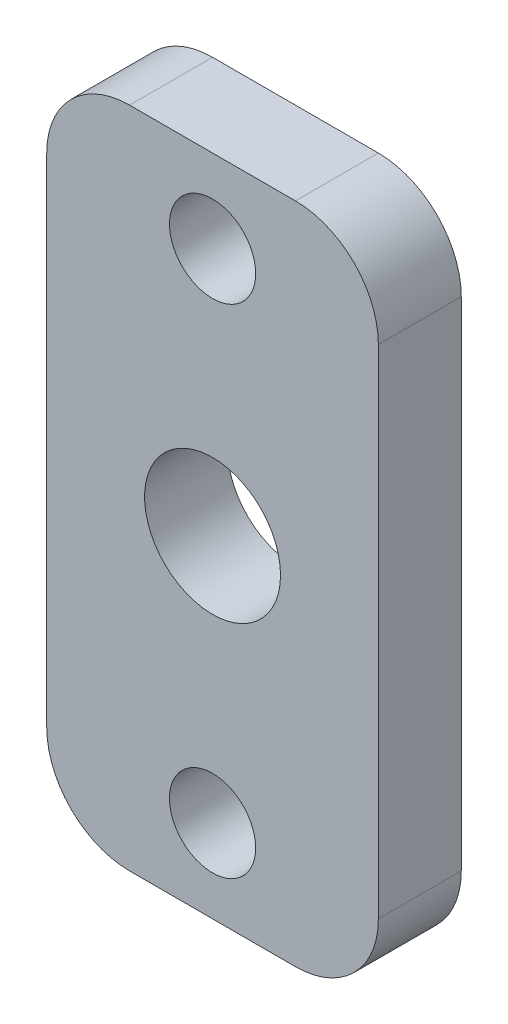
ISO-10303-21;
HEADER;
FILE_DESCRIPTION(('STEP AP214'),'2;1');
FILE_NAME('part.step','',(''),(''),'','','');
FILE_SCHEMA(('AUTOMOTIVE_DESIGN { 1 0 10303 214 1 1 1 1 }'));
ENDSEC;
DATA;
#1=APPLICATION_CONTEXT('core data for automotive mechanical design processes');
#2=APPLICATION_PROTOCOL_DEFINITION('international standard','automotive_design',2000,#1);
#3=PRODUCT_CONTEXT('',#1,'mechanical');
#4=PRODUCT('Part','Part','',(#3));
#5=PRODUCT_RELATED_PRODUCT_CATEGORY('part','',(#4));
#6=PRODUCT_DEFINITION_FORMATION('','',#4);
#7=PRODUCT_DEFINITION_CONTEXT('part definition',#1,'design');
#8=PRODUCT_DEFINITION('design','',#6,#7);
#9=PRODUCT_DEFINITION_SHAPE('','',#8);
#10=(LENGTH_UNIT() NAMED_UNIT(*) SI_UNIT(.MILLI.,.METRE.));
#11=(NAMED_UNIT(*) PLANE_ANGLE_UNIT() SI_UNIT($,.RADIAN.));
#12=(NAMED_UNIT(*) SI_UNIT($,.STERADIAN.) SOLID_ANGLE_UNIT());
#13=UNCERTAINTY_MEASURE_WITH_UNIT(LENGTH_MEASURE(1.E-05),#10,'distance_accuracy_value','');
#14=(GEOMETRIC_REPRESENTATION_CONTEXT(3) GLOBAL_UNCERTAINTY_ASSIGNED_CONTEXT((#13)) GLOBAL_UNIT_ASSIGNED_CONTEXT((#10,
#11,#12)) REPRESENTATION_CONTEXT('',''));
#15=CARTESIAN_POINT('',(0.,0.,0.));
#16=DIRECTION('',(0.,0.,1.));
#17=DIRECTION('',(1.,0.,0.));
#18=AXIS2_PLACEMENT_3D('',#15,#16,#17);
#19=CARTESIAN_POINT('',(10.,20.,2.5));
#20=DIRECTION('',(-1.,0.,0.));
#21=DIRECTION('',(0.,-1.,0.));
#22=AXIS2_PLACEMENT_3D('',#19,#20,#21);
#23=PLANE('',#22);
#24=DIRECTION('',(0.,1.,0.));
#25=VECTOR('',#24,1.);
#26=CARTESIAN_POINT('',(10.,20.,2.5));
#27=LINE('',#26,#25);
#28=CARTESIAN_POINT('',(10.,-15.,2.5));
#29=VERTEX_POINT('',#28);
#30=CARTESIAN_POINT('',(10.,15.,2.5));
#31=VERTEX_POINT('',#30);
#32=EDGE_CURVE('E118',#29,#31,#27,.T.);
#33=ORIENTED_EDGE('',*,*,#32,.F.);
#34=DIRECTION('',(0.,0.,-1.));
#35=VECTOR('',#34,1.);
#36=CARTESIAN_POINT('',(10.,-15.,2.5));
#37=LINE('',#36,#35);
#38=CARTESIAN_POINT('',(10.,-15.,-2.5));
#39=VERTEX_POINT('',#38);
#40=EDGE_CURVE('E103',#29,#39,#37,.T.);
#41=ORIENTED_EDGE('',*,*,#40,.T.);
#42=DIRECTION('',(0.,1.,0.));
#43=VECTOR('',#42,1.);
#44=CARTESIAN_POINT('',(10.,20.,-2.5));
#45=LINE('',#44,#43);
#46=CARTESIAN_POINT('',(10.,15.,-2.5));
#47=VERTEX_POINT('',#46);
#48=EDGE_CURVE('E115',#39,#47,#45,.T.);
#49=ORIENTED_EDGE('',*,*,#48,.T.);
#50=DIRECTION('',(0.,0.,-1.));
#51=VECTOR('',#50,1.);
#52=CARTESIAN_POINT('',(10.,15.,2.5));
#53=LINE('',#52,#51);
#54=EDGE_CURVE('E120',#47,#31,#53,.F.);
#55=ORIENTED_EDGE('',*,*,#54,.T.);
#56=EDGE_LOOP('',(#33,#41,#49,#55));
#57=FACE_BOUND('',#56,.T.);
#58=ADVANCED_FACE('F32',(#57),#23,.F.);
#59=CARTESIAN_POINT('',(-10.,20.,2.5));
#60=DIRECTION('',(0.,-1.,0.));
#61=DIRECTION('',(0.,0.,-1.));
#62=AXIS2_PLACEMENT_3D('',#59,#60,#61);
#63=PLANE('',#62);
#64=DIRECTION('',(-1.,0.,0.));
#65=VECTOR('',#64,1.);
#66=CARTESIAN_POINT('',(-10.,20.,2.5));
#67=LINE('',#66,#65);
#68=CARTESIAN_POINT('',(5.,20.,2.5));
#69=VERTEX_POINT('',#68);
#70=CARTESIAN_POINT('',(-5.,20.,2.5));
#71=VERTEX_POINT('',#70);
#72=EDGE_CURVE('E162',#69,#71,#67,.T.);
#73=ORIENTED_EDGE('',*,*,#72,.F.);
#74=DIRECTION('',(0.,0.,-1.));
#75=VECTOR('',#74,1.);
#76=CARTESIAN_POINT('',(5.,20.,2.5));
#77=LINE('',#76,#75);
#78=CARTESIAN_POINT('',(5.,20.,-2.5));
#79=VERTEX_POINT('',#78);
#80=EDGE_CURVE('E11',#69,#79,#77,.T.);
#81=ORIENTED_EDGE('',*,*,#80,.T.);
#82=DIRECTION('',(-1.,0.,0.));
#83=VECTOR('',#82,1.);
#84=CARTESIAN_POINT('',(-10.,20.,-2.5));
#85=LINE('',#84,#83);
#86=CARTESIAN_POINT('',(-5.,20.,-2.5));
#87=VERTEX_POINT('',#86);
#88=EDGE_CURVE('E125',#79,#87,#85,.T.);
#89=ORIENTED_EDGE('',*,*,#88,.T.);
#90=DIRECTION('',(0.,0.,-1.));
#91=VECTOR('',#90,1.);
#92=CARTESIAN_POINT('',(-5.,20.,2.5));
#93=LINE('',#92,#91);
#94=EDGE_CURVE('E40',#87,#71,#93,.F.);
#95=ORIENTED_EDGE('',*,*,#94,.T.);
#96=EDGE_LOOP('',(#73,#81,#89,#95));
#97=FACE_BOUND('',#96,.T.);
#98=ADVANCED_FACE('F161',(#97),#63,.F.);
#99=CARTESIAN_POINT('',(-10.,20.,2.5));
#100=DIRECTION('',(1.,0.,0.));
#101=DIRECTION('',(0.,1.,0.));
#102=AXIS2_PLACEMENT_3D('',#99,#100,#101);
#103=PLANE('',#102);
#104=DIRECTION('',(0.,-1.,0.));
#105=VECTOR('',#104,1.);
#106=CARTESIAN_POINT('',(-10.,20.,-2.5));
#107=LINE('',#106,#105);
#108=CARTESIAN_POINT('',(-10.,15.,-2.5));
#109=VERTEX_POINT('',#108);
#110=CARTESIAN_POINT('',(-9.99999999999999,-15.,-2.5));
#111=VERTEX_POINT('',#110);
#112=EDGE_CURVE('E129',#109,#111,#107,.T.);
#113=ORIENTED_EDGE('',*,*,#112,.T.);
#114=DIRECTION('',(0.,0.,-1.));
#115=VECTOR('',#114,1.);
#116=CARTESIAN_POINT('',(-9.99999999999999,-15.,2.5));
#117=LINE('',#116,#115);
#118=CARTESIAN_POINT('',(-9.99999999999999,-15.,2.5));
#119=VERTEX_POINT('',#118);
#120=EDGE_CURVE('E47',#111,#119,#117,.F.);
#121=ORIENTED_EDGE('',*,*,#120,.T.);
#122=DIRECTION('',(0.,-1.,0.));
#123=VECTOR('',#122,1.);
#124=CARTESIAN_POINT('',(-10.,20.,2.5));
#125=LINE('',#124,#123);
#126=CARTESIAN_POINT('',(-10.,15.,2.5));
#127=VERTEX_POINT('',#126);
#128=EDGE_CURVE('E168',#127,#119,#125,.T.);
#129=ORIENTED_EDGE('',*,*,#128,.F.);
#130=DIRECTION('',(0.,0.,-1.));
#131=VECTOR('',#130,1.);
#132=CARTESIAN_POINT('',(-10.,15.,2.5));
#133=LINE('',#132,#131);
#134=EDGE_CURVE('E155',#127,#109,#133,.T.);
#135=ORIENTED_EDGE('',*,*,#134,.T.);
#136=EDGE_LOOP('',(#113,#121,#129,#135));
#137=FACE_BOUND('',#136,.T.);
#138=ADVANCED_FACE('F172',(#137),#103,.F.);
#139=CARTESIAN_POINT('',(-9.99999999999999,-20.,2.5));
#140=DIRECTION('',(0.,1.,0.));
#141=DIRECTION('',(0.,0.,1.));
#142=AXIS2_PLACEMENT_3D('',#139,#140,#141);
#143=PLANE('',#142);
#144=DIRECTION('',(1.,0.,0.));
#145=VECTOR('',#144,1.);
#146=CARTESIAN_POINT('',(-9.99999999999999,-20.,-2.5));
#147=LINE('',#146,#145);
#148=CARTESIAN_POINT('',(-5.,-20.,-2.5));
#149=VERTEX_POINT('',#148);
#150=CARTESIAN_POINT('',(5.,-20.,-2.5));
#151=VERTEX_POINT('',#150);
#152=EDGE_CURVE('E139',#149,#151,#147,.T.);
#153=ORIENTED_EDGE('',*,*,#152,.T.);
#154=DIRECTION('',(0.,0.,-1.));
#155=VECTOR('',#154,1.);
#156=CARTESIAN_POINT('',(5.,-20.,2.5));
#157=LINE('',#156,#155);
#158=CARTESIAN_POINT('',(5.,-20.,2.5));
#159=VERTEX_POINT('',#158);
#160=EDGE_CURVE('E104',#151,#159,#157,.F.);
#161=ORIENTED_EDGE('',*,*,#160,.T.);
#162=DIRECTION('',(1.,0.,0.));
#163=VECTOR('',#162,1.);
#164=CARTESIAN_POINT('',(-9.99999999999999,-20.,2.5));
#165=LINE('',#164,#163);
#166=CARTESIAN_POINT('',(-5.,-20.,2.5));
#167=VERTEX_POINT('',#166);
#168=EDGE_CURVE('E135',#167,#159,#165,.T.);
#169=ORIENTED_EDGE('',*,*,#168,.F.);
#170=DIRECTION('',(0.,0.,-1.));
#171=VECTOR('',#170,1.);
#172=CARTESIAN_POINT('',(-5.,-20.,2.5));
#173=LINE('',#172,#171);
#174=EDGE_CURVE('E109',#167,#149,#173,.T.);
#175=ORIENTED_EDGE('',*,*,#174,.T.);
#176=EDGE_LOOP('',(#153,#161,#169,#175));
#177=FACE_BOUND('',#176,.T.);
#178=ADVANCED_FACE('F179',(#177),#143,.F.);
#179=CARTESIAN_POINT('',(0.,0.,2.5));
#180=DIRECTION('',(0.,0.,1.));
#181=DIRECTION('',(1.,0.,0.));
#182=AXIS2_PLACEMENT_3D('',#179,#180,#181);
#183=PLANE('',#182);
#184=CARTESIAN_POINT('',(0.,-15.,2.5));
#185=DIRECTION('',(0.,0.,-1.));
#186=DIRECTION('',(1.,0.,0.));
#187=AXIS2_PLACEMENT_3D('',#184,#185,#186);
#188=CIRCLE('',#187,2.6);
#189=CARTESIAN_POINT('',(2.6,-15.,2.5));
#190=VERTEX_POINT('',#189);
#191=EDGE_CURVE('E191',#190,#190,#188,.T.);
#192=ORIENTED_EDGE('',*,*,#191,.T.);
#193=EDGE_LOOP('',(#192));
#194=FACE_BOUND('',#193,.T.);
#195=CARTESIAN_POINT('',(0.,15.,2.5));
#196=DIRECTION('',(0.,0.,1.));
#197=DIRECTION('',(1.,0.,0.));
#198=AXIS2_PLACEMENT_3D('',#195,#196,#197);
#199=CIRCLE('',#198,2.6);
#200=CARTESIAN_POINT('',(2.6,15.,2.5));
#201=VERTEX_POINT('',#200);
#202=EDGE_CURVE('E185',#201,#201,#199,.T.);
#203=ORIENTED_EDGE('',*,*,#202,.F.);
#204=EDGE_LOOP('',(#203));
#205=FACE_BOUND('',#204,.T.);
#206=CARTESIAN_POINT('',(0.,0.,2.5));
#207=DIRECTION('',(0.,0.,1.));
#208=DIRECTION('',(1.,0.,0.));
#209=AXIS2_PLACEMENT_3D('',#206,#207,#208);
#210=CIRCLE('',#209,4.1);
#211=CARTESIAN_POINT('',(4.1,0.,2.5));
#212=VERTEX_POINT('',#211);
#213=EDGE_CURVE('E132',#212,#212,#210,.T.);
#214=ORIENTED_EDGE('',*,*,#213,.F.);
#215=EDGE_LOOP('',(#214));
#216=FACE_BOUND('',#215,.T.);
#217=ORIENTED_EDGE('',*,*,#168,.T.);
#218=CARTESIAN_POINT('',(5.,-15.,2.5));
#219=DIRECTION('',(0.,0.,1.));
#220=DIRECTION('',(1.,0.,0.));
#221=AXIS2_PLACEMENT_3D('',#218,#219,#220);
#222=CIRCLE('',#221,5.);
#223=EDGE_CURVE('E153',#159,#29,#222,.T.);
#224=ORIENTED_EDGE('',*,*,#223,.T.);
#225=ORIENTED_EDGE('',*,*,#32,.T.);
#226=CARTESIAN_POINT('',(5.,15.,2.5));
#227=DIRECTION('',(0.,0.,1.));
#228=DIRECTION('',(1.,0.,0.));
#229=AXIS2_PLACEMENT_3D('',#226,#227,#228);
#230=CIRCLE('',#229,5.);
#231=EDGE_CURVE('E149',#31,#69,#230,.T.);
#232=ORIENTED_EDGE('',*,*,#231,.T.);
#233=ORIENTED_EDGE('',*,*,#72,.T.);
#234=CARTESIAN_POINT('',(-5.,15.,2.5));
#235=DIRECTION('',(0.,0.,1.));
#236=DIRECTION('',(1.,0.,0.));
#237=AXIS2_PLACEMENT_3D('',#234,#235,#236);
#238=CIRCLE('',#237,5.);
#239=EDGE_CURVE('E54',#71,#127,#238,.T.);
#240=ORIENTED_EDGE('',*,*,#239,.T.);
#241=ORIENTED_EDGE('',*,*,#128,.T.);
#242=CARTESIAN_POINT('',(-5.,-15.,2.5));
#243=DIRECTION('',(0.,0.,1.));
#244=DIRECTION('',(1.,0.,0.));
#245=AXIS2_PLACEMENT_3D('',#242,#243,#244);
#246=CIRCLE('',#245,5.);
#247=EDGE_CURVE('E151',#119,#167,#246,.T.);
#248=ORIENTED_EDGE('',*,*,#247,.T.);
#249=EDGE_LOOP('',(#217,#224,#225,#232,#233,#240,#241,#248));
#250=FACE_BOUND('',#249,.T.);
#251=ADVANCED_FACE('F166',(#194,#205,#216,#250),#183,.T.);
#252=CARTESIAN_POINT('',(0.,0.,-2.5));
#253=DIRECTION('',(0.,0.,1.));
#254=DIRECTION('',(1.,0.,0.));
#255=AXIS2_PLACEMENT_3D('',#252,#253,#254);
#256=PLANE('',#255);
#257=CARTESIAN_POINT('',(0.,-15.,-2.5));
#258=DIRECTION('',(0.,0.,-1.));
#259=DIRECTION('',(1.,0.,0.));
#260=AXIS2_PLACEMENT_3D('',#257,#258,#259);
#261=CIRCLE('',#260,2.6);
#262=CARTESIAN_POINT('',(2.6,-15.,-2.5));
#263=VERTEX_POINT('',#262);
#264=EDGE_CURVE('E188',#263,#263,#261,.T.);
#265=ORIENTED_EDGE('',*,*,#264,.F.);
#266=EDGE_LOOP('',(#265));
#267=FACE_BOUND('',#266,.T.);
#268=CARTESIAN_POINT('',(0.,15.,-2.5));
#269=DIRECTION('',(0.,0.,1.));
#270=DIRECTION('',(1.,0.,0.));
#271=AXIS2_PLACEMENT_3D('',#268,#269,#270);
#272=CIRCLE('',#271,2.6);
#273=CARTESIAN_POINT('',(2.6,15.,-2.5));
#274=VERTEX_POINT('',#273);
#275=EDGE_CURVE('E183',#274,#274,#272,.T.);
#276=ORIENTED_EDGE('',*,*,#275,.T.);
#277=EDGE_LOOP('',(#276));
#278=FACE_BOUND('',#277,.T.);
#279=CARTESIAN_POINT('',(0.,0.,-2.5));
#280=DIRECTION('',(0.,0.,1.));
#281=DIRECTION('',(1.,0.,0.));
#282=AXIS2_PLACEMENT_3D('',#279,#280,#281);
#283=CIRCLE('',#282,4.1);
#284=CARTESIAN_POINT('',(4.1,0.,-2.5));
#285=VERTEX_POINT('',#284);
#286=EDGE_CURVE('E126',#285,#285,#283,.T.);
#287=ORIENTED_EDGE('',*,*,#286,.T.);
#288=EDGE_LOOP('',(#287));
#289=FACE_BOUND('',#288,.T.);
#290=ORIENTED_EDGE('',*,*,#48,.F.);
#291=CARTESIAN_POINT('',(5.,-15.,-2.5));
#292=DIRECTION('',(0.,0.,1.));
#293=DIRECTION('',(1.,0.,0.));
#294=AXIS2_PLACEMENT_3D('',#291,#292,#293);
#295=CIRCLE('',#294,5.);
#296=EDGE_CURVE('E99',#39,#151,#295,.F.);
#297=ORIENTED_EDGE('',*,*,#296,.T.);
#298=ORIENTED_EDGE('',*,*,#152,.F.);
#299=CARTESIAN_POINT('',(-5.,-15.,-2.5));
#300=DIRECTION('',(0.,0.,1.));
#301=DIRECTION('',(1.,0.,0.));
#302=AXIS2_PLACEMENT_3D('',#299,#300,#301);
#303=CIRCLE('',#302,5.);
#304=EDGE_CURVE('E110',#149,#111,#303,.F.);
#305=ORIENTED_EDGE('',*,*,#304,.T.);
#306=ORIENTED_EDGE('',*,*,#112,.F.);
#307=CARTESIAN_POINT('',(-5.,15.,-2.5));
#308=DIRECTION('',(0.,0.,1.));
#309=DIRECTION('',(1.,0.,0.));
#310=AXIS2_PLACEMENT_3D('',#307,#308,#309);
#311=CIRCLE('',#310,5.);
#312=EDGE_CURVE('E119',#109,#87,#311,.F.);
#313=ORIENTED_EDGE('',*,*,#312,.T.);
#314=ORIENTED_EDGE('',*,*,#88,.F.);
#315=CARTESIAN_POINT('',(5.,15.,-2.5));
#316=DIRECTION('',(0.,0.,1.));
#317=DIRECTION('',(1.,0.,0.));
#318=AXIS2_PLACEMENT_3D('',#315,#316,#317);
#319=CIRCLE('',#318,5.);
#320=EDGE_CURVE('E124',#79,#47,#319,.F.);
#321=ORIENTED_EDGE('',*,*,#320,.T.);
#322=EDGE_LOOP('',(#290,#297,#298,#305,#306,#313,#314,#321));
#323=FACE_BOUND('',#322,.T.);
#324=ADVANCED_FACE('F122',(#267,#278,#289,#323),#256,.F.);
#325=CARTESIAN_POINT('',(0.,0.,-2.5));
#326=DIRECTION('',(0.,0.,1.));
#327=DIRECTION('',(1.,0.,0.));
#328=AXIS2_PLACEMENT_3D('',#325,#326,#327);
#329=CYLINDRICAL_SURFACE('',#328,4.1);
#330=ORIENTED_EDGE('',*,*,#286,.F.);
#331=EDGE_LOOP('',(#330));
#332=FACE_BOUND('',#331,.T.);
#333=ORIENTED_EDGE('',*,*,#213,.T.);
#334=EDGE_LOOP('',(#333));
#335=FACE_BOUND('',#334,.T.);
#336=ADVANCED_FACE('F202',(#332,#335),#329,.F.);
#337=CARTESIAN_POINT('',(0.,15.,-2.5));
#338=DIRECTION('',(0.,0.,1.));
#339=DIRECTION('',(1.,0.,0.));
#340=AXIS2_PLACEMENT_3D('',#337,#338,#339);
#341=CYLINDRICAL_SURFACE('',#340,2.6);
#342=ORIENTED_EDGE('',*,*,#275,.F.);
#343=EDGE_LOOP('',(#342));
#344=FACE_BOUND('',#343,.T.);
#345=ORIENTED_EDGE('',*,*,#202,.T.);
#346=EDGE_LOOP('',(#345));
#347=FACE_BOUND('',#346,.T.);
#348=ADVANCED_FACE('F210',(#344,#347),#341,.F.);
#349=CARTESIAN_POINT('',(0.,-15.,-2.5));
#350=DIRECTION('',(0.,0.,1.));
#351=DIRECTION('',(1.,0.,0.));
#352=AXIS2_PLACEMENT_3D('',#349,#350,#351);
#353=CYLINDRICAL_SURFACE('',#352,2.6);
#354=ORIENTED_EDGE('',*,*,#264,.T.);
#355=EDGE_LOOP('',(#354));
#356=FACE_BOUND('',#355,.T.);
#357=ORIENTED_EDGE('',*,*,#191,.F.);
#358=EDGE_LOOP('',(#357));
#359=FACE_BOUND('',#358,.T.);
#360=ADVANCED_FACE('F197',(#356,#359),#353,.F.);
#361=CARTESIAN_POINT('',(5.,-15.,2.5));
#362=DIRECTION('',(0.,0.,-1.));
#363=DIRECTION('',(-1.,0.,0.));
#364=AXIS2_PLACEMENT_3D('',#361,#362,#363);
#365=CYLINDRICAL_SURFACE('',#364,5.);
#366=ORIENTED_EDGE('',*,*,#223,.F.);
#367=ORIENTED_EDGE('',*,*,#160,.F.);
#368=ORIENTED_EDGE('',*,*,#296,.F.);
#369=ORIENTED_EDGE('',*,*,#40,.F.);
#370=EDGE_LOOP('',(#366,#367,#368,#369));
#371=FACE_BOUND('',#370,.T.);
#372=ADVANCED_FACE('F102',(#371),#365,.T.);
#373=CARTESIAN_POINT('',(-5.,-15.,2.5));
#374=DIRECTION('',(0.,0.,-1.));
#375=DIRECTION('',(-1.,0.,0.));
#376=AXIS2_PLACEMENT_3D('',#373,#374,#375);
#377=CYLINDRICAL_SURFACE('',#376,5.);
#378=ORIENTED_EDGE('',*,*,#247,.F.);
#379=ORIENTED_EDGE('',*,*,#120,.F.);
#380=ORIENTED_EDGE('',*,*,#304,.F.);
#381=ORIENTED_EDGE('',*,*,#174,.F.);
#382=EDGE_LOOP('',(#378,#379,#380,#381));
#383=FACE_BOUND('',#382,.T.);
#384=ADVANCED_FACE('F176',(#383),#377,.T.);
#385=CARTESIAN_POINT('',(5.,15.,2.5));
#386=DIRECTION('',(0.,0.,-1.));
#387=DIRECTION('',(-1.,0.,0.));
#388=AXIS2_PLACEMENT_3D('',#385,#386,#387);
#389=CYLINDRICAL_SURFACE('',#388,5.);
#390=ORIENTED_EDGE('',*,*,#231,.F.);
#391=ORIENTED_EDGE('',*,*,#54,.F.);
#392=ORIENTED_EDGE('',*,*,#320,.F.);
#393=ORIENTED_EDGE('',*,*,#80,.F.);
#394=EDGE_LOOP('',(#390,#391,#392,#393));
#395=FACE_BOUND('',#394,.T.);
#396=ADVANCED_FACE('F233',(#395),#389,.T.);
#397=CARTESIAN_POINT('',(-5.,15.,2.5));
#398=DIRECTION('',(0.,0.,-1.));
#399=DIRECTION('',(-1.,0.,0.));
#400=AXIS2_PLACEMENT_3D('',#397,#398,#399);
#401=CYLINDRICAL_SURFACE('',#400,5.);
#402=ORIENTED_EDGE('',*,*,#239,.F.);
#403=ORIENTED_EDGE('',*,*,#94,.F.);
#404=ORIENTED_EDGE('',*,*,#312,.F.);
#405=ORIENTED_EDGE('',*,*,#134,.F.);
#406=EDGE_LOOP('',(#402,#403,#404,#405));
#407=FACE_BOUND('',#406,.T.);
#408=ADVANCED_FACE('F34',(#407),#401,.T.);
#409=CLOSED_SHELL('',(#58,#98,#138,#178,#251,#324,#336,#348,#360,#372,#384,#396,#408));
#410=MANIFOLD_SOLID_BREP('B2',#409);
#411=ADVANCED_BREP_SHAPE_REPRESENTATION('',(#18,#410),#14);
#412=SHAPE_DEFINITION_REPRESENTATION(#9,#411);
ENDSEC;
END-ISO-10303-21;
